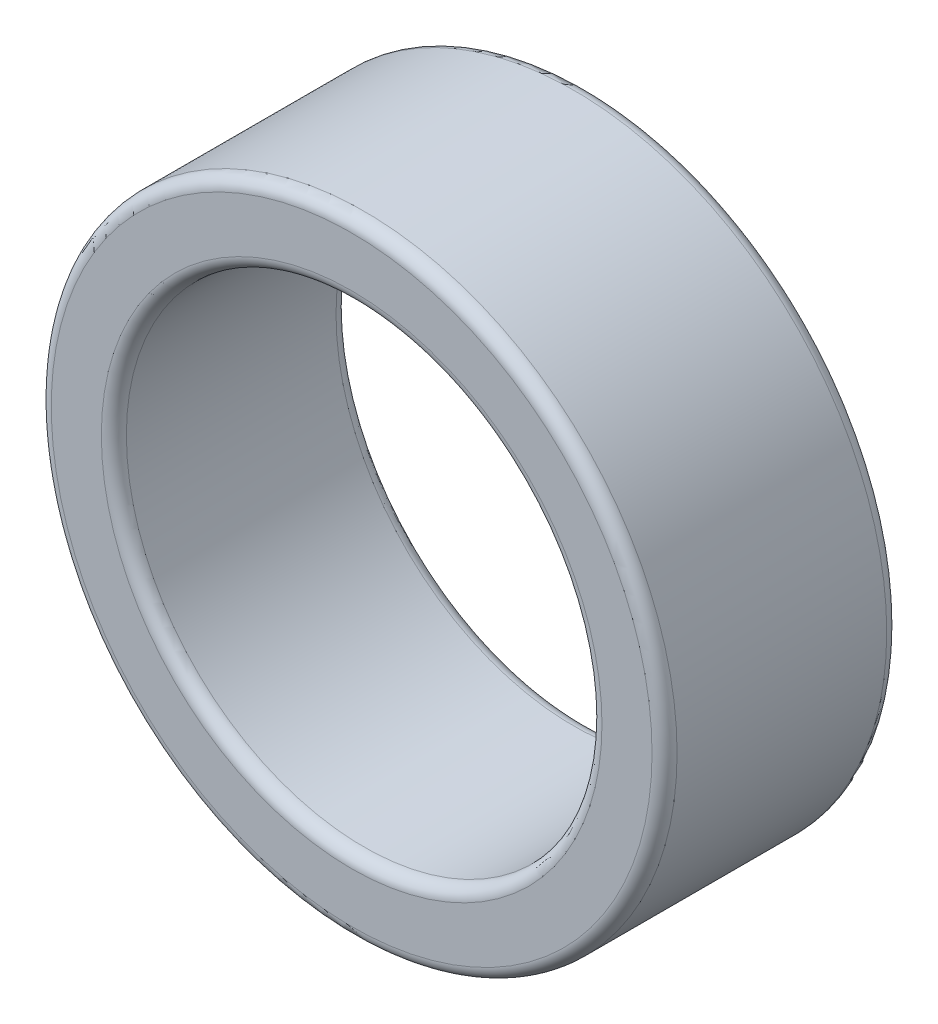
ISO-10303-21;
HEADER;
FILE_DESCRIPTION(('STEP AP214'),'2;1');
FILE_NAME('part.step','',(''),(''),'','','');
FILE_SCHEMA(('AUTOMOTIVE_DESIGN { 1 0 10303 214 1 1 1 1 }'));
ENDSEC;
DATA;
#1=APPLICATION_CONTEXT('core data for automotive mechanical design processes');
#2=APPLICATION_PROTOCOL_DEFINITION('international standard','automotive_design',2000,#1);
#3=PRODUCT_CONTEXT('',#1,'mechanical');
#4=PRODUCT('Part','Part','',(#3));
#5=PRODUCT_RELATED_PRODUCT_CATEGORY('part','',(#4));
#6=PRODUCT_DEFINITION_FORMATION('','',#4);
#7=PRODUCT_DEFINITION_CONTEXT('part definition',#1,'design');
#8=PRODUCT_DEFINITION('design','',#6,#7);
#9=PRODUCT_DEFINITION_SHAPE('','',#8);
#10=(LENGTH_UNIT() NAMED_UNIT(*) SI_UNIT(.MILLI.,.METRE.));
#11=(NAMED_UNIT(*) PLANE_ANGLE_UNIT() SI_UNIT($,.RADIAN.));
#12=(NAMED_UNIT(*) SI_UNIT($,.STERADIAN.) SOLID_ANGLE_UNIT());
#13=UNCERTAINTY_MEASURE_WITH_UNIT(LENGTH_MEASURE(1.E-05),#10,'distance_accuracy_value','');
#14=(GEOMETRIC_REPRESENTATION_CONTEXT(3) GLOBAL_UNCERTAINTY_ASSIGNED_CONTEXT((#13)) GLOBAL_UNIT_ASSIGNED_CONTEXT((#10,
#11,#12)) REPRESENTATION_CONTEXT('',''));
#15=CARTESIAN_POINT('',(0.,0.,0.));
#16=DIRECTION('',(0.,0.,1.));
#17=DIRECTION('',(1.,0.,0.));
#18=AXIS2_PLACEMENT_3D('',#15,#16,#17);
#19=CARTESIAN_POINT('',(0.,0.,9.525));
#20=DIRECTION('',(0.,0.,1.));
#21=DIRECTION('',(1.,0.,0.));
#22=AXIS2_PLACEMENT_3D('',#19,#20,#21);
#23=PLANE('',#22);
#24=CARTESIAN_POINT('',(0.,0.,9.525));
#25=DIRECTION('',(0.,0.,1.));
#26=DIRECTION('',(1.,0.,0.));
#27=AXIS2_PLACEMENT_3D('',#24,#25,#26);
#28=CIRCLE('',#27,12.192);
#29=CARTESIAN_POINT('',(12.192,0.,9.525));
#30=VERTEX_POINT('',#29);
#31=EDGE_CURVE('E53',#30,#30,#28,.T.);
#32=ORIENTED_EDGE('',*,*,#31,.T.);
#33=EDGE_LOOP('',(#32));
#34=FACE_BOUND('',#33,.T.);
#35=CARTESIAN_POINT('',(0.,0.,9.525));
#36=DIRECTION('',(0.,0.,1.));
#37=DIRECTION('',(1.,0.,0.));
#38=AXIS2_PLACEMENT_3D('',#35,#36,#37);
#39=CIRCLE('',#38,10.16);
#40=CARTESIAN_POINT('',(10.16,0.,9.525));
#41=VERTEX_POINT('',#40);
#42=EDGE_CURVE('E58',#41,#41,#39,.F.);
#43=ORIENTED_EDGE('',*,*,#42,.T.);
#44=EDGE_LOOP('',(#43));
#45=FACE_BOUND('',#44,.T.);
#46=ADVANCED_FACE('F40',(#34,#45),#23,.T.);
#47=CARTESIAN_POINT('',(0.,0.,0.));
#48=DIRECTION('',(0.,0.,1.));
#49=DIRECTION('',(1.,0.,0.));
#50=AXIS2_PLACEMENT_3D('',#47,#48,#49);
#51=PLANE('',#50);
#52=CARTESIAN_POINT('',(0.,0.,0.));
#53=DIRECTION('',(0.,0.,1.));
#54=DIRECTION('',(1.,0.,0.));
#55=AXIS2_PLACEMENT_3D('',#52,#53,#54);
#56=CIRCLE('',#55,12.192);
#57=CARTESIAN_POINT('',(12.192,0.,0.));
#58=VERTEX_POINT('',#57);
#59=EDGE_CURVE('E64',#58,#58,#56,.F.);
#60=ORIENTED_EDGE('',*,*,#59,.T.);
#61=EDGE_LOOP('',(#60));
#62=FACE_BOUND('',#61,.T.);
#63=CARTESIAN_POINT('',(0.,0.,0.));
#64=DIRECTION('',(0.,0.,1.));
#65=DIRECTION('',(1.,0.,0.));
#66=AXIS2_PLACEMENT_3D('',#63,#64,#65);
#67=CIRCLE('',#66,10.16);
#68=CARTESIAN_POINT('',(10.16,0.,0.));
#69=VERTEX_POINT('',#68);
#70=EDGE_CURVE('E68',#69,#69,#67,.T.);
#71=ORIENTED_EDGE('',*,*,#70,.T.);
#72=EDGE_LOOP('',(#71));
#73=FACE_BOUND('',#72,.T.);
#74=ADVANCED_FACE('F93',(#62,#73),#51,.F.);
#75=CARTESIAN_POINT('',(0.,0.,9.525));
#76=DIRECTION('',(0.,0.,-1.));
#77=DIRECTION('',(-1.,0.,0.));
#78=AXIS2_PLACEMENT_3D('',#75,#76,#77);
#79=CYLINDRICAL_SURFACE('',#78,12.7);
#80=CARTESIAN_POINT('',(0.,0.,0.508));
#81=DIRECTION('',(0.,0.,1.));
#82=DIRECTION('',(1.,0.,0.));
#83=AXIS2_PLACEMENT_3D('',#80,#81,#82);
#84=CIRCLE('',#83,12.7);
#85=CARTESIAN_POINT('',(-12.7,0.,0.507999999999998));
#86=VERTEX_POINT('',#85);
#87=EDGE_CURVE('E72',#86,#86,#84,.T.);
#88=CARTESIAN_POINT('',(0.,0.,9.017));
#89=DIRECTION('',(0.,0.,1.));
#90=DIRECTION('',(1.,0.,0.));
#91=AXIS2_PLACEMENT_3D('',#88,#89,#90);
#92=CIRCLE('',#91,12.7);
#93=CARTESIAN_POINT('',(-12.7,0.,9.017));
#94=VERTEX_POINT('',#93);
#95=EDGE_CURVE('E76',#94,#94,#92,.F.);
#96=CARTESIAN_POINT('',(-12.7,0.,0.507999999999998));
#97=CARTESIAN_POINT('',(-12.7,0.,0.596635416666665));
#98=CARTESIAN_POINT('',(-12.7,0.,0.685270833333331));
#99=CARTESIAN_POINT('',(-12.7,0.,0.862541666666664));
#100=CARTESIAN_POINT('',(-12.7,0.,0.951177083333331));
#101=CARTESIAN_POINT('',(-12.7,0.,1.12844791666666));
#102=CARTESIAN_POINT('',(-12.7,0.,1.21708333333333));
#103=CARTESIAN_POINT('',(-12.7,0.,1.39435416666667));
#104=CARTESIAN_POINT('',(-12.7,0.,1.48298958333333));
#105=CARTESIAN_POINT('',(-12.7,0.,1.66026041666666));
#106=CARTESIAN_POINT('',(-12.7,0.,1.74889583333333));
#107=CARTESIAN_POINT('',(-12.7,0.,1.92616666666666));
#108=CARTESIAN_POINT('',(-12.7,0.,2.01480208333333));
#109=CARTESIAN_POINT('',(-12.7,0.,2.19207291666666));
#110=CARTESIAN_POINT('',(-12.7,0.,2.28070833333333));
#111=CARTESIAN_POINT('',(-12.7,0.,2.45797916666666));
#112=CARTESIAN_POINT('',(-12.7,0.,2.54661458333333));
#113=CARTESIAN_POINT('',(-12.7,0.,2.72388541666666));
#114=CARTESIAN_POINT('',(-12.7,0.,2.81252083333333));
#115=CARTESIAN_POINT('',(-12.7,0.,2.98979166666666));
#116=CARTESIAN_POINT('',(-12.7,0.,3.07842708333333));
#117=CARTESIAN_POINT('',(-12.7,0.,3.25569791666666));
#118=CARTESIAN_POINT('',(-12.7,0.,3.34433333333333));
#119=CARTESIAN_POINT('',(-12.7,0.,3.52160416666666));
#120=CARTESIAN_POINT('',(-12.7,0.,3.61023958333333));
#121=CARTESIAN_POINT('',(-12.7,0.,3.78751041666666));
#122=CARTESIAN_POINT('',(-12.7,0.,3.87614583333333));
#123=CARTESIAN_POINT('',(-12.7,0.,4.05341666666666));
#124=CARTESIAN_POINT('',(-12.7,0.,4.14205208333333));
#125=CARTESIAN_POINT('',(-12.7,0.,4.31932291666666));
#126=CARTESIAN_POINT('',(-12.7,0.,4.40795833333333));
#127=CARTESIAN_POINT('',(-12.7,0.,4.58522916666667));
#128=CARTESIAN_POINT('',(-12.7,0.,4.67386458333333));
#129=CARTESIAN_POINT('',(-12.7,0.,4.85113541666666));
#130=CARTESIAN_POINT('',(-12.7,0.,4.93977083333333));
#131=CARTESIAN_POINT('',(-12.7,0.,5.11704166666666));
#132=CARTESIAN_POINT('',(-12.7,0.,5.20567708333333));
#133=CARTESIAN_POINT('',(-12.7,0.,5.38294791666666));
#134=CARTESIAN_POINT('',(-12.7,0.,5.47158333333333));
#135=CARTESIAN_POINT('',(-12.7,0.,5.64885416666667));
#136=CARTESIAN_POINT('',(-12.7,0.,5.73748958333333));
#137=CARTESIAN_POINT('',(-12.7,0.,5.91476041666666));
#138=CARTESIAN_POINT('',(-12.7,0.,6.00339583333333));
#139=CARTESIAN_POINT('',(-12.7,0.,6.18066666666667));
#140=CARTESIAN_POINT('',(-12.7,0.,6.26930208333333));
#141=CARTESIAN_POINT('',(-12.7,0.,6.44657291666667));
#142=CARTESIAN_POINT('',(-12.7,0.,6.53520833333333));
#143=CARTESIAN_POINT('',(-12.7,0.,6.71247916666667));
#144=CARTESIAN_POINT('',(-12.7,0.,6.80111458333333));
#145=CARTESIAN_POINT('',(-12.7,0.,6.97838541666667));
#146=CARTESIAN_POINT('',(-12.7,0.,7.06702083333333));
#147=CARTESIAN_POINT('',(-12.7,0.,7.24429166666667));
#148=CARTESIAN_POINT('',(-12.7,0.,7.33292708333333));
#149=CARTESIAN_POINT('',(-12.7,0.,7.51019791666667));
#150=CARTESIAN_POINT('',(-12.7,0.,7.59883333333333));
#151=CARTESIAN_POINT('',(-12.7,0.,7.77610416666667));
#152=CARTESIAN_POINT('',(-12.7,0.,7.86473958333333));
#153=CARTESIAN_POINT('',(-12.7,0.,8.04201041666667));
#154=CARTESIAN_POINT('',(-12.7,0.,8.13064583333333));
#155=CARTESIAN_POINT('',(-12.7,0.,8.30791666666667));
#156=CARTESIAN_POINT('',(-12.7,0.,8.39655208333333));
#157=CARTESIAN_POINT('',(-12.7,0.,8.57382291666667));
#158=CARTESIAN_POINT('',(-12.7,0.,8.66245833333333));
#159=CARTESIAN_POINT('',(-12.7,0.,8.83972916666667));
#160=CARTESIAN_POINT('',(-12.7,0.,8.92836458333333));
#161=CARTESIAN_POINT('',(-12.7,0.,9.017));
#162=B_SPLINE_CURVE_WITH_KNOTS('',3,(#96,#97,#98,#99,#100,#101,#102,#103,#104,#105,#106,#107,
#108,#109,#110,#111,#112,#113,#114,#115,#116,#117,#118,#119,#120,#121,#122,#123,#124,#125,#126,
#127,#128,#129,#130,#131,#132,#133,#134,#135,#136,#137,#138,#139,#140,#141,#142,#143,#144,#145,
#146,#147,#148,#149,#150,#151,#152,#153,#154,#155,#156,#157,#158,#159,#160,#161),.UNSPECIFIED.,
.F.,.F.,(4,2,2,2,2,2,2,2,2,2,2,2,2,2,2,2,2,2,2,2,2,2,2,2,2,2,2,2,2,2,2,2,4),(0.,0.26590625,
0.531812499999999,0.797718750000001,1.063625,1.32953125,1.5954375,1.86134375,2.12725,2.39315625,
2.6590625,2.92496875,3.190875,3.45678125,3.7226875,3.98859375,4.2545,4.52040625,4.7863125,
5.05221875,5.318125,5.58403125,5.8499375,6.11584375,6.38175,6.64765625,6.9135625,7.17946875,
7.445375,7.71128125,7.9771875,8.24309375,8.509),.UNSPECIFIED.);
#163=EDGE_CURVE('BSEAM81',#86,#94,#162,.T.);
#164=ORIENTED_EDGE('',*,*,#87,.T.);
#165=ORIENTED_EDGE('',*,*,#95,.T.);
#166=ORIENTED_EDGE('',*,*,#163,.T.);
#167=ORIENTED_EDGE('',*,*,#163,.F.);
#168=EDGE_LOOP('',(#164,#166,#165,#167));
#169=FACE_BOUND('',#168,.T.);
#170=ADVANCED_FACE('F81',(#169),#79,.T.);
#171=CARTESIAN_POINT('',(0.,0.,9.525));
#172=DIRECTION('',(0.,0.,-1.));
#173=DIRECTION('',(-1.,0.,0.));
#174=AXIS2_PLACEMENT_3D('',#171,#172,#173);
#175=CYLINDRICAL_SURFACE('',#174,9.652);
#176=CARTESIAN_POINT('',(0.,0.,0.508));
#177=DIRECTION('',(0.,0.,1.));
#178=DIRECTION('',(1.,0.,0.));
#179=AXIS2_PLACEMENT_3D('',#176,#177,#178);
#180=CIRCLE('',#179,9.652);
#181=CARTESIAN_POINT('',(-9.652,0.,0.507999999999998));
#182=VERTEX_POINT('',#181);
#183=EDGE_CURVE('E10',#182,#182,#180,.F.);
#184=CARTESIAN_POINT('',(0.,0.,9.017));
#185=DIRECTION('',(0.,0.,1.));
#186=DIRECTION('',(1.,0.,0.));
#187=AXIS2_PLACEMENT_3D('',#184,#185,#186);
#188=CIRCLE('',#187,9.652);
#189=CARTESIAN_POINT('',(-9.652,0.,9.017));
#190=VERTEX_POINT('',#189);
#191=EDGE_CURVE('E48',#190,#190,#188,.T.);
#192=CARTESIAN_POINT('',(-9.652,0.,0.507999999999998));
#193=CARTESIAN_POINT('',(-9.652,0.,0.596635416666665));
#194=CARTESIAN_POINT('',(-9.652,0.,0.685270833333331));
#195=CARTESIAN_POINT('',(-9.652,0.,0.862541666666664));
#196=CARTESIAN_POINT('',(-9.652,0.,0.951177083333331));
#197=CARTESIAN_POINT('',(-9.652,0.,1.12844791666666));
#198=CARTESIAN_POINT('',(-9.652,0.,1.21708333333333));
#199=CARTESIAN_POINT('',(-9.652,0.,1.39435416666667));
#200=CARTESIAN_POINT('',(-9.652,0.,1.48298958333333));
#201=CARTESIAN_POINT('',(-9.652,0.,1.66026041666666));
#202=CARTESIAN_POINT('',(-9.652,0.,1.74889583333333));
#203=CARTESIAN_POINT('',(-9.652,0.,1.92616666666666));
#204=CARTESIAN_POINT('',(-9.652,0.,2.01480208333333));
#205=CARTESIAN_POINT('',(-9.652,0.,2.19207291666666));
#206=CARTESIAN_POINT('',(-9.652,0.,2.28070833333333));
#207=CARTESIAN_POINT('',(-9.652,0.,2.45797916666666));
#208=CARTESIAN_POINT('',(-9.652,0.,2.54661458333333));
#209=CARTESIAN_POINT('',(-9.652,0.,2.72388541666666));
#210=CARTESIAN_POINT('',(-9.652,0.,2.81252083333333));
#211=CARTESIAN_POINT('',(-9.652,0.,2.98979166666666));
#212=CARTESIAN_POINT('',(-9.652,0.,3.07842708333333));
#213=CARTESIAN_POINT('',(-9.652,0.,3.25569791666666));
#214=CARTESIAN_POINT('',(-9.652,0.,3.34433333333333));
#215=CARTESIAN_POINT('',(-9.652,0.,3.52160416666666));
#216=CARTESIAN_POINT('',(-9.652,0.,3.61023958333333));
#217=CARTESIAN_POINT('',(-9.652,0.,3.78751041666666));
#218=CARTESIAN_POINT('',(-9.652,0.,3.87614583333333));
#219=CARTESIAN_POINT('',(-9.652,0.,4.05341666666666));
#220=CARTESIAN_POINT('',(-9.652,0.,4.14205208333333));
#221=CARTESIAN_POINT('',(-9.652,0.,4.31932291666666));
#222=CARTESIAN_POINT('',(-9.652,0.,4.40795833333333));
#223=CARTESIAN_POINT('',(-9.652,0.,4.58522916666667));
#224=CARTESIAN_POINT('',(-9.652,0.,4.67386458333333));
#225=CARTESIAN_POINT('',(-9.652,0.,4.85113541666666));
#226=CARTESIAN_POINT('',(-9.652,0.,4.93977083333333));
#227=CARTESIAN_POINT('',(-9.652,0.,5.11704166666666));
#228=CARTESIAN_POINT('',(-9.652,0.,5.20567708333333));
#229=CARTESIAN_POINT('',(-9.652,0.,5.38294791666666));
#230=CARTESIAN_POINT('',(-9.652,0.,5.47158333333333));
#231=CARTESIAN_POINT('',(-9.652,0.,5.64885416666667));
#232=CARTESIAN_POINT('',(-9.652,0.,5.73748958333333));
#233=CARTESIAN_POINT('',(-9.652,0.,5.91476041666666));
#234=CARTESIAN_POINT('',(-9.652,0.,6.00339583333333));
#235=CARTESIAN_POINT('',(-9.652,0.,6.18066666666667));
#236=CARTESIAN_POINT('',(-9.652,0.,6.26930208333333));
#237=CARTESIAN_POINT('',(-9.652,0.,6.44657291666667));
#238=CARTESIAN_POINT('',(-9.652,0.,6.53520833333333));
#239=CARTESIAN_POINT('',(-9.652,0.,6.71247916666667));
#240=CARTESIAN_POINT('',(-9.652,0.,6.80111458333333));
#241=CARTESIAN_POINT('',(-9.652,0.,6.97838541666667));
#242=CARTESIAN_POINT('',(-9.652,0.,7.06702083333333));
#243=CARTESIAN_POINT('',(-9.652,0.,7.24429166666667));
#244=CARTESIAN_POINT('',(-9.652,0.,7.33292708333333));
#245=CARTESIAN_POINT('',(-9.652,0.,7.51019791666667));
#246=CARTESIAN_POINT('',(-9.652,0.,7.59883333333333));
#247=CARTESIAN_POINT('',(-9.652,0.,7.77610416666667));
#248=CARTESIAN_POINT('',(-9.652,0.,7.86473958333333));
#249=CARTESIAN_POINT('',(-9.652,0.,8.04201041666667));
#250=CARTESIAN_POINT('',(-9.652,0.,8.13064583333333));
#251=CARTESIAN_POINT('',(-9.652,0.,8.30791666666667));
#252=CARTESIAN_POINT('',(-9.652,0.,8.39655208333333));
#253=CARTESIAN_POINT('',(-9.652,0.,8.57382291666667));
#254=CARTESIAN_POINT('',(-9.652,0.,8.66245833333333));
#255=CARTESIAN_POINT('',(-9.652,0.,8.83972916666667));
#256=CARTESIAN_POINT('',(-9.652,0.,8.92836458333333));
#257=CARTESIAN_POINT('',(-9.652,0.,9.017));
#258=B_SPLINE_CURVE_WITH_KNOTS('',3,(#192,#193,#194,#195,#196,#197,#198,#199,#200,#201,#202,
#203,#204,#205,#206,#207,#208,#209,#210,#211,#212,#213,#214,#215,#216,#217,#218,#219,#220,#221,
#222,#223,#224,#225,#226,#227,#228,#229,#230,#231,#232,#233,#234,#235,#236,#237,#238,#239,#240,
#241,#242,#243,#244,#245,#246,#247,#248,#249,#250,#251,#252,#253,#254,#255,#256,#257),
.UNSPECIFIED.,.F.,.F.,(4,2,2,2,2,2,2,2,2,2,2,2,2,2,2,2,2,2,2,2,2,2,2,2,2,2,2,2,2,2,2,2,4),(0.,
0.26590625,0.531812499999999,0.797718750000001,1.063625,1.32953125,1.5954375,1.86134375,2.12725,
2.39315625,2.6590625,2.92496875,3.190875,3.45678125,3.7226875,3.98859375,4.2545,4.52040625,
4.7863125,5.05221875,5.318125,5.58403125,5.8499375,6.11584375,6.38175,6.64765625,6.9135625,
7.17946875,7.445375,7.71128125,7.9771875,8.24309375,8.509),.UNSPECIFIED.);
#259=EDGE_CURVE('BSEAM109',#182,#190,#258,.T.);
#260=ORIENTED_EDGE('',*,*,#183,.T.);
#261=ORIENTED_EDGE('',*,*,#191,.T.);
#262=ORIENTED_EDGE('',*,*,#259,.T.);
#263=ORIENTED_EDGE('',*,*,#259,.F.);
#264=EDGE_LOOP('',(#260,#262,#261,#263));
#265=FACE_BOUND('',#264,.T.);
#266=ADVANCED_FACE('F109',(#265),#175,.F.);
#267=CARTESIAN_POINT('',(0.,0.,0.508));
#268=DIRECTION('',(0.,0.,1.));
#269=DIRECTION('',(1.,0.,0.));
#270=AXIS2_PLACEMENT_3D('',#267,#268,#269);
#271=TOROIDAL_SURFACE('',#270,12.192,0.508);
#272=ORIENTED_EDGE('',*,*,#59,.F.);
#273=EDGE_LOOP('',(#272));
#274=FACE_BOUND('',#273,.T.);
#275=ORIENTED_EDGE('',*,*,#87,.F.);
#276=EDGE_LOOP('',(#275));
#277=FACE_BOUND('',#276,.T.);
#278=ADVANCED_FACE('F87',(#274,#277),#271,.T.);
#279=CARTESIAN_POINT('',(0.,0.,9.017));
#280=DIRECTION('',(0.,0.,1.));
#281=DIRECTION('',(1.,0.,0.));
#282=AXIS2_PLACEMENT_3D('',#279,#280,#281);
#283=TOROIDAL_SURFACE('',#282,12.192,0.508);
#284=ORIENTED_EDGE('',*,*,#95,.F.);
#285=EDGE_LOOP('',(#284));
#286=FACE_BOUND('',#285,.T.);
#287=ORIENTED_EDGE('',*,*,#31,.F.);
#288=EDGE_LOOP('',(#287));
#289=FACE_BOUND('',#288,.T.);
#290=ADVANCED_FACE('F83',(#286,#289),#283,.T.);
#291=CARTESIAN_POINT('',(0.,0.,0.508));
#292=DIRECTION('',(0.,0.,1.));
#293=DIRECTION('',(1.,0.,0.));
#294=AXIS2_PLACEMENT_3D('',#291,#292,#293);
#295=TOROIDAL_SURFACE('',#294,10.16,0.508);
#296=ORIENTED_EDGE('',*,*,#183,.F.);
#297=EDGE_LOOP('',(#296));
#298=FACE_BOUND('',#297,.T.);
#299=ORIENTED_EDGE('',*,*,#70,.F.);
#300=EDGE_LOOP('',(#299));
#301=FACE_BOUND('',#300,.T.);
#302=ADVANCED_FACE('F86',(#298,#301),#295,.T.);
#303=CARTESIAN_POINT('',(0.,0.,9.017));
#304=DIRECTION('',(0.,0.,1.));
#305=DIRECTION('',(1.,0.,0.));
#306=AXIS2_PLACEMENT_3D('',#303,#304,#305);
#307=TOROIDAL_SURFACE('',#306,10.16,0.508);
#308=ORIENTED_EDGE('',*,*,#42,.F.);
#309=EDGE_LOOP('',(#308));
#310=FACE_BOUND('',#309,.T.);
#311=ORIENTED_EDGE('',*,*,#191,.F.);
#312=EDGE_LOOP('',(#311));
#313=FACE_BOUND('',#312,.T.);
#314=ADVANCED_FACE('F42',(#310,#313),#307,.T.);
#315=CLOSED_SHELL('',(#46,#74,#170,#266,#278,#290,#302,#314));
#316=MANIFOLD_SOLID_BREP('B2',#315);
#317=ADVANCED_BREP_SHAPE_REPRESENTATION('',(#18,#316),#14);
#318=SHAPE_DEFINITION_REPRESENTATION(#9,#317);
ENDSEC;
END-ISO-10303-21;
